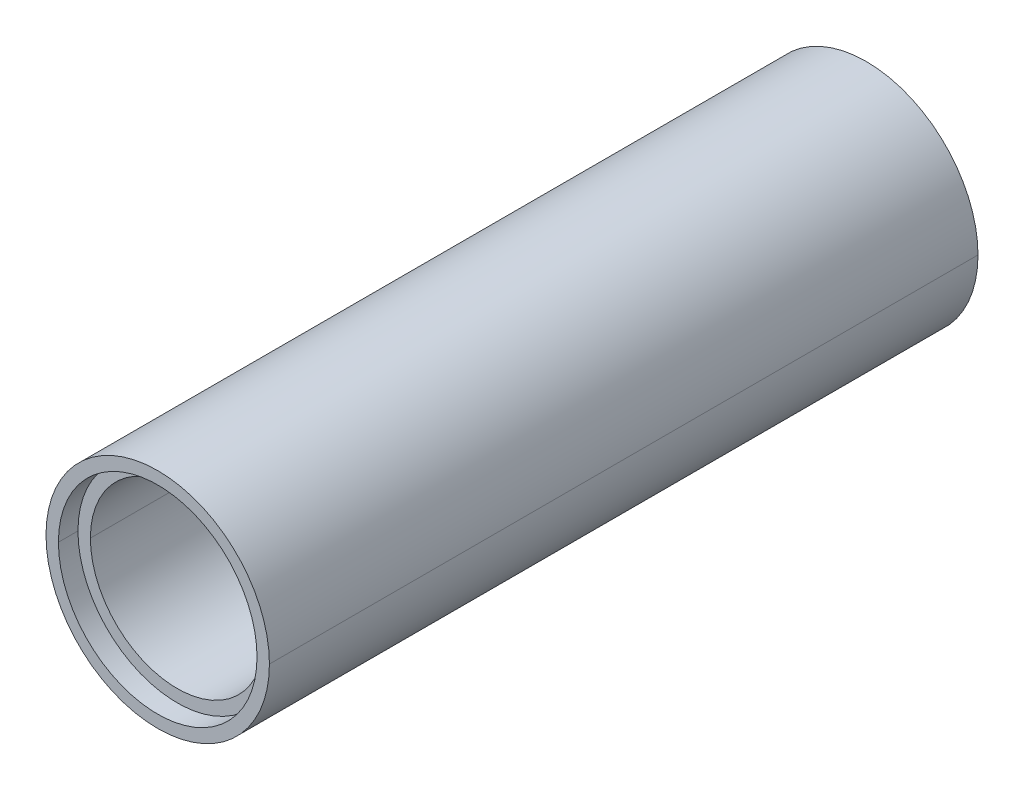
ISO-10303-21;
HEADER;
FILE_DESCRIPTION(('STEP AP214'),'2;1');
FILE_NAME('part.step','',(''),(''),'','','');
FILE_SCHEMA(('AUTOMOTIVE_DESIGN { 1 0 10303 214 1 1 1 1 }'));
ENDSEC;
DATA;
#1=APPLICATION_CONTEXT('core data for automotive mechanical design processes');
#2=APPLICATION_PROTOCOL_DEFINITION('international standard','automotive_design',2000,#1);
#3=PRODUCT_CONTEXT('',#1,'mechanical');
#4=PRODUCT('Part','Part','',(#3));
#5=PRODUCT_RELATED_PRODUCT_CATEGORY('part','',(#4));
#6=PRODUCT_DEFINITION_FORMATION('','',#4);
#7=PRODUCT_DEFINITION_CONTEXT('part definition',#1,'design');
#8=PRODUCT_DEFINITION('design','',#6,#7);
#9=PRODUCT_DEFINITION_SHAPE('','',#8);
#10=(LENGTH_UNIT() NAMED_UNIT(*) SI_UNIT(.MILLI.,.METRE.));
#11=(NAMED_UNIT(*) PLANE_ANGLE_UNIT() SI_UNIT($,.RADIAN.));
#12=(NAMED_UNIT(*) SI_UNIT($,.STERADIAN.) SOLID_ANGLE_UNIT());
#13=UNCERTAINTY_MEASURE_WITH_UNIT(LENGTH_MEASURE(1.E-05),#10,'distance_accuracy_value','');
#14=(GEOMETRIC_REPRESENTATION_CONTEXT(3) GLOBAL_UNCERTAINTY_ASSIGNED_CONTEXT((#13)) GLOBAL_UNIT_ASSIGNED_CONTEXT((#10,
#11,#12)) REPRESENTATION_CONTEXT('',''));
#15=CARTESIAN_POINT('',(0.,0.,0.));
#16=DIRECTION('',(0.,0.,1.));
#17=DIRECTION('',(1.,0.,0.));
#18=AXIS2_PLACEMENT_3D('',#15,#16,#17);
#19=CARTESIAN_POINT('',(0.,0.,352.5));
#20=DIRECTION('',(0.,0.,1.));
#21=DIRECTION('',(1.,0.,0.));
#22=AXIS2_PLACEMENT_3D('',#19,#20,#21);
#23=PLANE('',#22);
#24=CARTESIAN_POINT('',(0.,0.,352.5));
#25=DIRECTION('',(0.,0.,1.));
#26=DIRECTION('',(1.,0.,0.));
#27=AXIS2_PLACEMENT_3D('',#24,#25,#26);
#28=CIRCLE('',#27,44.45);
#29=CARTESIAN_POINT('',(-44.45,0.,352.5));
#30=VERTEX_POINT('',#29);
#31=CARTESIAN_POINT('',(44.45,0.,352.5));
#32=VERTEX_POINT('',#31);
#33=EDGE_CURVE('E136',#30,#32,#28,.T.);
#34=ORIENTED_EDGE('',*,*,#33,.F.);
#35=CARTESIAN_POINT('',(0.,0.,352.5));
#36=DIRECTION('',(0.,0.,1.));
#37=DIRECTION('',(1.,0.,0.));
#38=AXIS2_PLACEMENT_3D('',#35,#36,#37);
#39=CIRCLE('',#38,44.45);
#40=EDGE_CURVE('E90',#32,#30,#39,.T.);
#41=ORIENTED_EDGE('',*,*,#40,.F.);
#42=EDGE_LOOP('',(#34,#41));
#43=FACE_BOUND('',#42,.T.);
#44=CARTESIAN_POINT('',(0.,0.,352.5));
#45=DIRECTION('',(0.,0.,1.));
#46=DIRECTION('',(1.,0.,0.));
#47=AXIS2_PLACEMENT_3D('',#44,#45,#46);
#48=CIRCLE('',#47,50.8);
#49=CARTESIAN_POINT('',(50.8,0.,352.5));
#50=VERTEX_POINT('',#49);
#51=CARTESIAN_POINT('',(-50.8,0.,352.5));
#52=VERTEX_POINT('',#51);
#53=EDGE_CURVE('E10',#50,#52,#48,.T.);
#54=ORIENTED_EDGE('',*,*,#53,.T.);
#55=CARTESIAN_POINT('',(0.,0.,352.5));
#56=DIRECTION('',(0.,0.,1.));
#57=DIRECTION('',(1.,0.,0.));
#58=AXIS2_PLACEMENT_3D('',#55,#56,#57);
#59=CIRCLE('',#58,50.8);
#60=EDGE_CURVE('E104',#52,#50,#59,.T.);
#61=ORIENTED_EDGE('',*,*,#60,.T.);
#62=EDGE_LOOP('',(#54,#61));
#63=FACE_BOUND('',#62,.T.);
#64=ADVANCED_FACE('F15',(#43,#63),#23,.T.);
#65=CARTESIAN_POINT('',(0.,0.,352.5));
#66=DIRECTION('',(0.,0.,1.));
#67=DIRECTION('',(1.,0.,0.));
#68=AXIS2_PLACEMENT_3D('',#65,#66,#67);
#69=CYLINDRICAL_SURFACE('',#68,50.8);
#70=DIRECTION('',(0.,0.,1.));
#71=VECTOR('',#70,1.);
#72=CARTESIAN_POINT('',(-50.8,0.,352.5));
#73=LINE('',#72,#71);
#74=CARTESIAN_POINT('',(-50.8,0.,362.5));
#75=VERTEX_POINT('',#74);
#76=EDGE_CURVE('E109',#52,#75,#73,.T.);
#77=ORIENTED_EDGE('',*,*,#76,.F.);
#78=ORIENTED_EDGE('',*,*,#53,.F.);
#79=DIRECTION('',(0.,0.,1.));
#80=VECTOR('',#79,1.);
#81=CARTESIAN_POINT('',(50.8,0.,352.5));
#82=LINE('',#81,#80);
#83=CARTESIAN_POINT('',(50.8,0.,362.5));
#84=VERTEX_POINT('',#83);
#85=EDGE_CURVE('E118',#50,#84,#82,.T.);
#86=ORIENTED_EDGE('',*,*,#85,.T.);
#87=CARTESIAN_POINT('',(0.,0.,362.5));
#88=DIRECTION('',(0.,0.,1.));
#89=DIRECTION('',(1.,0.,0.));
#90=AXIS2_PLACEMENT_3D('',#87,#88,#89);
#91=CIRCLE('',#90,50.8);
#92=EDGE_CURVE('E111',#84,#75,#91,.T.);
#93=ORIENTED_EDGE('',*,*,#92,.T.);
#94=EDGE_LOOP('',(#77,#78,#86,#93));
#95=FACE_BOUND('',#94,.T.);
#96=ADVANCED_FACE('F110',(#95),#69,.F.);
#97=CARTESIAN_POINT('',(0.,0.,362.5));
#98=DIRECTION('',(0.,0.,-1.));
#99=DIRECTION('',(-1.,0.,0.));
#100=AXIS2_PLACEMENT_3D('',#97,#98,#99);
#101=CYLINDRICAL_SURFACE('',#100,57.15);
#102=DIRECTION('',(0.,0.,-1.));
#103=VECTOR('',#102,1.);
#104=CARTESIAN_POINT('',(57.15,0.,362.5));
#105=LINE('',#104,#103);
#106=CARTESIAN_POINT('',(57.15,0.,362.5));
#107=VERTEX_POINT('',#106);
#108=CARTESIAN_POINT('',(57.15,0.,0.));
#109=VERTEX_POINT('',#108);
#110=EDGE_CURVE('E127',#107,#109,#105,.T.);
#111=ORIENTED_EDGE('',*,*,#110,.F.);
#112=CARTESIAN_POINT('',(0.,0.,362.5));
#113=DIRECTION('',(0.,0.,1.));
#114=DIRECTION('',(1.,0.,0.));
#115=AXIS2_PLACEMENT_3D('',#112,#113,#114);
#116=CIRCLE('',#115,57.15);
#117=CARTESIAN_POINT('',(-57.15,0.,362.5));
#118=VERTEX_POINT('',#117);
#119=EDGE_CURVE('E68',#118,#107,#116,.T.);
#120=ORIENTED_EDGE('',*,*,#119,.F.);
#121=DIRECTION('',(0.,0.,-1.));
#122=VECTOR('',#121,1.);
#123=CARTESIAN_POINT('',(-57.15,0.,362.5));
#124=LINE('',#123,#122);
#125=CARTESIAN_POINT('',(-57.15,0.,0.));
#126=VERTEX_POINT('',#125);
#127=EDGE_CURVE('E133',#118,#126,#124,.T.);
#128=ORIENTED_EDGE('',*,*,#127,.T.);
#129=CARTESIAN_POINT('',(0.,0.,0.));
#130=DIRECTION('',(0.,0.,1.));
#131=DIRECTION('',(1.,0.,0.));
#132=AXIS2_PLACEMENT_3D('',#129,#130,#131);
#133=CIRCLE('',#132,57.15);
#134=EDGE_CURVE('E25',#126,#109,#133,.T.);
#135=ORIENTED_EDGE('',*,*,#134,.T.);
#136=EDGE_LOOP('',(#111,#120,#128,#135));
#137=FACE_BOUND('',#136,.T.);
#138=ADVANCED_FACE('F275',(#137),#101,.T.);
#139=CARTESIAN_POINT('',(0.,0.,0.));
#140=DIRECTION('',(0.,0.,1.));
#141=DIRECTION('',(1.,0.,0.));
#142=AXIS2_PLACEMENT_3D('',#139,#140,#141);
#143=PLANE('',#142);
#144=CARTESIAN_POINT('',(0.,0.,0.));
#145=DIRECTION('',(0.,0.,1.));
#146=DIRECTION('',(1.,0.,0.));
#147=AXIS2_PLACEMENT_3D('',#144,#145,#146);
#148=CIRCLE('',#147,44.45);
#149=CARTESIAN_POINT('',(-44.45,0.,0.));
#150=VERTEX_POINT('',#149);
#151=CARTESIAN_POINT('',(44.45,0.,0.));
#152=VERTEX_POINT('',#151);
#153=EDGE_CURVE('E142',#150,#152,#148,.T.);
#154=ORIENTED_EDGE('',*,*,#153,.T.);
#155=CARTESIAN_POINT('',(0.,0.,0.));
#156=DIRECTION('',(0.,0.,1.));
#157=DIRECTION('',(1.,0.,0.));
#158=AXIS2_PLACEMENT_3D('',#155,#156,#157);
#159=CIRCLE('',#158,44.45);
#160=EDGE_CURVE('E39',#152,#150,#159,.T.);
#161=ORIENTED_EDGE('',*,*,#160,.T.);
#162=EDGE_LOOP('',(#154,#161));
#163=FACE_BOUND('',#162,.T.);
#164=ORIENTED_EDGE('',*,*,#134,.F.);
#165=CARTESIAN_POINT('',(0.,0.,0.));
#166=DIRECTION('',(0.,0.,1.));
#167=DIRECTION('',(1.,0.,0.));
#168=AXIS2_PLACEMENT_3D('',#165,#166,#167);
#169=CIRCLE('',#168,57.15);
#170=EDGE_CURVE('E130',#109,#126,#169,.T.);
#171=ORIENTED_EDGE('',*,*,#170,.F.);
#172=EDGE_LOOP('',(#164,#171));
#173=FACE_BOUND('',#172,.T.);
#174=ADVANCED_FACE('F285',(#163,#173),#143,.F.);
#175=CARTESIAN_POINT('',(0.,0.,362.5));
#176=DIRECTION('',(0.,0.,1.));
#177=DIRECTION('',(1.,0.,0.));
#178=AXIS2_PLACEMENT_3D('',#175,#176,#177);
#179=PLANE('',#178);
#180=ORIENTED_EDGE('',*,*,#92,.F.);
#181=CARTESIAN_POINT('',(0.,0.,362.5));
#182=DIRECTION('',(0.,0.,1.));
#183=DIRECTION('',(1.,0.,0.));
#184=AXIS2_PLACEMENT_3D('',#181,#182,#183);
#185=CIRCLE('',#184,50.8);
#186=EDGE_CURVE('E18',#75,#84,#185,.T.);
#187=ORIENTED_EDGE('',*,*,#186,.F.);
#188=EDGE_LOOP('',(#180,#187));
#189=FACE_BOUND('',#188,.T.);
#190=ORIENTED_EDGE('',*,*,#119,.T.);
#191=CARTESIAN_POINT('',(0.,0.,362.5));
#192=DIRECTION('',(0.,0.,1.));
#193=DIRECTION('',(1.,0.,0.));
#194=AXIS2_PLACEMENT_3D('',#191,#192,#193);
#195=CIRCLE('',#194,57.15);
#196=EDGE_CURVE('E131',#107,#118,#195,.T.);
#197=ORIENTED_EDGE('',*,*,#196,.T.);
#198=EDGE_LOOP('',(#190,#197));
#199=FACE_BOUND('',#198,.T.);
#200=ADVANCED_FACE('F295',(#189,#199),#179,.T.);
#201=CARTESIAN_POINT('',(0.,0.,362.5));
#202=DIRECTION('',(0.,0.,-1.));
#203=DIRECTION('',(-1.,0.,0.));
#204=AXIS2_PLACEMENT_3D('',#201,#202,#203);
#205=CYLINDRICAL_SURFACE('',#204,44.45);
#206=DIRECTION('',(0.,0.,-1.));
#207=VECTOR('',#206,1.);
#208=CARTESIAN_POINT('',(44.45,0.,362.5));
#209=LINE('',#208,#207);
#210=EDGE_CURVE('E145',#32,#152,#209,.T.);
#211=ORIENTED_EDGE('',*,*,#210,.F.);
#212=ORIENTED_EDGE('',*,*,#40,.T.);
#213=DIRECTION('',(0.,0.,-1.));
#214=VECTOR('',#213,1.);
#215=CARTESIAN_POINT('',(-44.45,0.,362.5));
#216=LINE('',#215,#214);
#217=EDGE_CURVE('E139',#30,#150,#216,.T.);
#218=ORIENTED_EDGE('',*,*,#217,.T.);
#219=ORIENTED_EDGE('',*,*,#160,.F.);
#220=EDGE_LOOP('',(#211,#212,#218,#219));
#221=FACE_BOUND('',#220,.T.);
#222=ADVANCED_FACE('F264',(#221),#205,.F.);
#223=CARTESIAN_POINT('',(0.,0.,362.5));
#224=DIRECTION('',(0.,0.,-1.));
#225=DIRECTION('',(-1.,0.,0.));
#226=AXIS2_PLACEMENT_3D('',#223,#224,#225);
#227=CYLINDRICAL_SURFACE('',#226,44.45);
#228=ORIENTED_EDGE('',*,*,#33,.T.);
#229=ORIENTED_EDGE('',*,*,#210,.T.);
#230=ORIENTED_EDGE('',*,*,#153,.F.);
#231=ORIENTED_EDGE('',*,*,#217,.F.);
#232=EDGE_LOOP('',(#228,#229,#230,#231));
#233=FACE_BOUND('',#232,.T.);
#234=ADVANCED_FACE('F258',(#233),#227,.F.);
#235=CARTESIAN_POINT('',(0.,0.,362.5));
#236=DIRECTION('',(0.,0.,-1.));
#237=DIRECTION('',(-1.,0.,0.));
#238=AXIS2_PLACEMENT_3D('',#235,#236,#237);
#239=CYLINDRICAL_SURFACE('',#238,57.15);
#240=ORIENTED_EDGE('',*,*,#196,.F.);
#241=ORIENTED_EDGE('',*,*,#110,.T.);
#242=ORIENTED_EDGE('',*,*,#170,.T.);
#243=ORIENTED_EDGE('',*,*,#127,.F.);
#244=EDGE_LOOP('',(#240,#241,#242,#243));
#245=FACE_BOUND('',#244,.T.);
#246=ADVANCED_FACE('F263',(#245),#239,.T.);
#247=CARTESIAN_POINT('',(0.,0.,352.5));
#248=DIRECTION('',(0.,0.,1.));
#249=DIRECTION('',(1.,0.,0.));
#250=AXIS2_PLACEMENT_3D('',#247,#248,#249);
#251=CYLINDRICAL_SURFACE('',#250,50.8);
#252=ORIENTED_EDGE('',*,*,#60,.F.);
#253=ORIENTED_EDGE('',*,*,#76,.T.);
#254=ORIENTED_EDGE('',*,*,#186,.T.);
#255=ORIENTED_EDGE('',*,*,#85,.F.);
#256=EDGE_LOOP('',(#252,#253,#254,#255));
#257=FACE_BOUND('',#256,.T.);
#258=ADVANCED_FACE('F117',(#257),#251,.F.);
#259=CLOSED_SHELL('',(#64,#96,#138,#174,#200,#222,#234,#246,#258));
#260=MANIFOLD_SOLID_BREP('B1',#259);
#261=ADVANCED_BREP_SHAPE_REPRESENTATION('',(#18,#260),#14);
#262=SHAPE_DEFINITION_REPRESENTATION(#9,#261);
ENDSEC;
END-ISO-10303-21;
